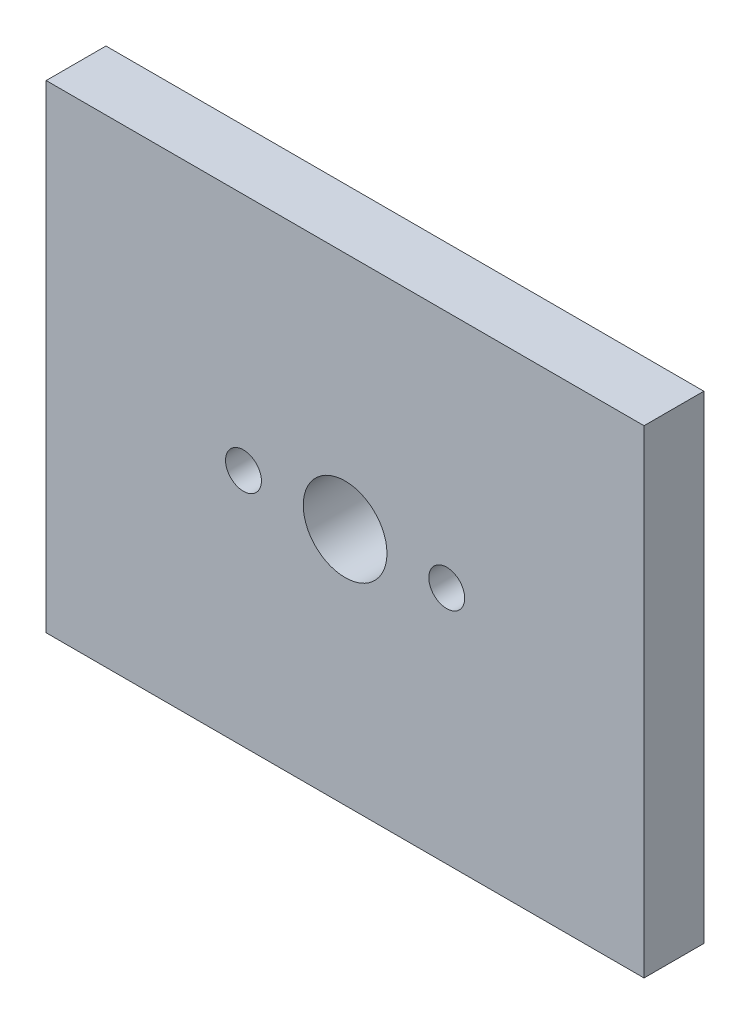
ISO-10303-21;
HEADER;
FILE_DESCRIPTION(('STEP AP214'),'2;1');
FILE_NAME('part.step','',(''),(''),'','','');
FILE_SCHEMA(('AUTOMOTIVE_DESIGN { 1 0 10303 214 1 1 1 1 }'));
ENDSEC;
DATA;
#1=APPLICATION_CONTEXT('core data for automotive mechanical design processes');
#2=APPLICATION_PROTOCOL_DEFINITION('international standard','automotive_design',2000,#1);
#3=PRODUCT_CONTEXT('',#1,'mechanical');
#4=PRODUCT('Part','Part','',(#3));
#5=PRODUCT_RELATED_PRODUCT_CATEGORY('part','',(#4));
#6=PRODUCT_DEFINITION_FORMATION('','',#4);
#7=PRODUCT_DEFINITION_CONTEXT('part definition',#1,'design');
#8=PRODUCT_DEFINITION('design','',#6,#7);
#9=PRODUCT_DEFINITION_SHAPE('','',#8);
#10=(LENGTH_UNIT() NAMED_UNIT(*) SI_UNIT(.MILLI.,.METRE.));
#11=(NAMED_UNIT(*) PLANE_ANGLE_UNIT() SI_UNIT($,.RADIAN.));
#12=(NAMED_UNIT(*) SI_UNIT($,.STERADIAN.) SOLID_ANGLE_UNIT());
#13=UNCERTAINTY_MEASURE_WITH_UNIT(LENGTH_MEASURE(1.E-05),#10,'distance_accuracy_value','');
#14=(GEOMETRIC_REPRESENTATION_CONTEXT(3) GLOBAL_UNCERTAINTY_ASSIGNED_CONTEXT((#13)) GLOBAL_UNIT_ASSIGNED_CONTEXT((#10,
#11,#12)) REPRESENTATION_CONTEXT('',''));
#15=CARTESIAN_POINT('',(0.,0.,0.));
#16=DIRECTION('',(0.,0.,1.));
#17=DIRECTION('',(1.,0.,0.));
#18=AXIS2_PLACEMENT_3D('',#15,#16,#17);
#19=CARTESIAN_POINT('',(-25.,-20.,5.));
#20=DIRECTION('',(1.,0.,0.));
#21=DIRECTION('',(0.,0.,-1.));
#22=AXIS2_PLACEMENT_3D('',#19,#20,#21);
#23=PLANE('',#22);
#24=DIRECTION('',(0.,-1.,0.));
#25=VECTOR('',#24,1.);
#26=CARTESIAN_POINT('',(-25.,-20.,0.));
#27=LINE('',#26,#25);
#28=CARTESIAN_POINT('',(-25.,20.,0.));
#29=VERTEX_POINT('',#28);
#30=CARTESIAN_POINT('',(-25.,-20.,0.));
#31=VERTEX_POINT('',#30);
#32=EDGE_CURVE('E106',#29,#31,#27,.T.);
#33=ORIENTED_EDGE('',*,*,#32,.T.);
#34=DIRECTION('',(0.,0.,-1.));
#35=VECTOR('',#34,1.);
#36=CARTESIAN_POINT('',(-25.,-20.,5.));
#37=LINE('',#36,#35);
#38=CARTESIAN_POINT('',(-25.,-20.,5.));
#39=VERTEX_POINT('',#38);
#40=EDGE_CURVE('E11',#39,#31,#37,.T.);
#41=ORIENTED_EDGE('',*,*,#40,.F.);
#42=DIRECTION('',(0.,-1.,0.));
#43=VECTOR('',#42,1.);
#44=CARTESIAN_POINT('',(-25.,-20.,5.));
#45=LINE('',#44,#43);
#46=CARTESIAN_POINT('',(-25.,20.,5.));
#47=VERTEX_POINT('',#46);
#48=EDGE_CURVE('E90',#47,#39,#45,.T.);
#49=ORIENTED_EDGE('',*,*,#48,.F.);
#50=DIRECTION('',(0.,0.,-1.));
#51=VECTOR('',#50,1.);
#52=CARTESIAN_POINT('',(-25.,20.,5.));
#53=LINE('',#52,#51);
#54=EDGE_CURVE('E102',#47,#29,#53,.T.);
#55=ORIENTED_EDGE('',*,*,#54,.T.);
#56=EDGE_LOOP('',(#33,#41,#49,#55));
#57=FACE_BOUND('',#56,.T.);
#58=ADVANCED_FACE('F38',(#57),#23,.F.);
#59=CARTESIAN_POINT('',(25.,-20.,5.));
#60=DIRECTION('',(0.,1.,0.));
#61=DIRECTION('',(-1.,0.,0.));
#62=AXIS2_PLACEMENT_3D('',#59,#60,#61);
#63=PLANE('',#62);
#64=DIRECTION('',(1.,0.,0.));
#65=VECTOR('',#64,1.);
#66=CARTESIAN_POINT('',(25.,-20.,0.));
#67=LINE('',#66,#65);
#68=CARTESIAN_POINT('',(25.,-20.,0.));
#69=VERTEX_POINT('',#68);
#70=EDGE_CURVE('E95',#31,#69,#67,.T.);
#71=ORIENTED_EDGE('',*,*,#70,.T.);
#72=DIRECTION('',(0.,0.,-1.));
#73=VECTOR('',#72,1.);
#74=CARTESIAN_POINT('',(25.,-20.,5.));
#75=LINE('',#74,#73);
#76=CARTESIAN_POINT('',(25.,-20.,5.));
#77=VERTEX_POINT('',#76);
#78=EDGE_CURVE('E47',#77,#69,#75,.T.);
#79=ORIENTED_EDGE('',*,*,#78,.F.);
#80=DIRECTION('',(1.,0.,0.));
#81=VECTOR('',#80,1.);
#82=CARTESIAN_POINT('',(25.,-20.,5.));
#83=LINE('',#82,#81);
#84=EDGE_CURVE('E85',#39,#77,#83,.T.);
#85=ORIENTED_EDGE('',*,*,#84,.F.);
#86=ORIENTED_EDGE('',*,*,#40,.T.);
#87=EDGE_LOOP('',(#71,#79,#85,#86));
#88=FACE_BOUND('',#87,.T.);
#89=ADVANCED_FACE('F94',(#88),#63,.F.);
#90=CARTESIAN_POINT('',(25.,-20.,5.));
#91=DIRECTION('',(-1.,0.,0.));
#92=DIRECTION('',(0.,0.,1.));
#93=AXIS2_PLACEMENT_3D('',#90,#91,#92);
#94=PLANE('',#93);
#95=DIRECTION('',(0.,1.,0.));
#96=VECTOR('',#95,1.);
#97=CARTESIAN_POINT('',(25.,-20.,0.));
#98=LINE('',#97,#96);
#99=CARTESIAN_POINT('',(25.,20.,0.));
#100=VERTEX_POINT('',#99);
#101=EDGE_CURVE('E72',#69,#100,#98,.T.);
#102=ORIENTED_EDGE('',*,*,#101,.T.);
#103=DIRECTION('',(0.,0.,-1.));
#104=VECTOR('',#103,1.);
#105=CARTESIAN_POINT('',(25.,20.,5.));
#106=LINE('',#105,#104);
#107=CARTESIAN_POINT('',(25.,20.,5.));
#108=VERTEX_POINT('',#107);
#109=EDGE_CURVE('E97',#108,#100,#106,.T.);
#110=ORIENTED_EDGE('',*,*,#109,.F.);
#111=DIRECTION('',(0.,1.,0.));
#112=VECTOR('',#111,1.);
#113=CARTESIAN_POINT('',(25.,-20.,5.));
#114=LINE('',#113,#112);
#115=EDGE_CURVE('E88',#77,#108,#114,.T.);
#116=ORIENTED_EDGE('',*,*,#115,.F.);
#117=ORIENTED_EDGE('',*,*,#78,.T.);
#118=EDGE_LOOP('',(#102,#110,#116,#117));
#119=FACE_BOUND('',#118,.T.);
#120=ADVANCED_FACE('F98',(#119),#94,.F.);
#121=CARTESIAN_POINT('',(25.,20.,5.));
#122=DIRECTION('',(0.,-1.,0.));
#123=DIRECTION('',(1.,0.,0.));
#124=AXIS2_PLACEMENT_3D('',#121,#122,#123);
#125=PLANE('',#124);
#126=DIRECTION('',(-1.,0.,0.));
#127=VECTOR('',#126,1.);
#128=CARTESIAN_POINT('',(25.,20.,0.));
#129=LINE('',#128,#127);
#130=EDGE_CURVE('E78',#100,#29,#129,.T.);
#131=ORIENTED_EDGE('',*,*,#130,.T.);
#132=ORIENTED_EDGE('',*,*,#54,.F.);
#133=DIRECTION('',(-1.,0.,0.));
#134=VECTOR('',#133,1.);
#135=CARTESIAN_POINT('',(25.,20.,5.));
#136=LINE('',#135,#134);
#137=EDGE_CURVE('E55',#108,#47,#136,.T.);
#138=ORIENTED_EDGE('',*,*,#137,.F.);
#139=ORIENTED_EDGE('',*,*,#109,.T.);
#140=EDGE_LOOP('',(#131,#132,#138,#139));
#141=FACE_BOUND('',#140,.T.);
#142=ADVANCED_FACE('F120',(#141),#125,.F.);
#143=CARTESIAN_POINT('',(0.,0.,5.));
#144=DIRECTION('',(0.,0.,1.));
#145=DIRECTION('',(1.,0.,0.));
#146=AXIS2_PLACEMENT_3D('',#143,#144,#145);
#147=PLANE('',#146);
#148=CARTESIAN_POINT('',(8.5,0.,5.));
#149=DIRECTION('',(0.,0.,1.));
#150=DIRECTION('',(1.,0.,0.));
#151=AXIS2_PLACEMENT_3D('',#148,#149,#150);
#152=CIRCLE('',#151,1.5);
#153=CARTESIAN_POINT('',(10.,0.,5.));
#154=VERTEX_POINT('',#153);
#155=EDGE_CURVE('E110',#154,#154,#152,.T.);
#156=ORIENTED_EDGE('',*,*,#155,.F.);
#157=EDGE_LOOP('',(#156));
#158=FACE_BOUND('',#157,.T.);
#159=CARTESIAN_POINT('',(0.,0.,5.));
#160=DIRECTION('',(0.,0.,1.));
#161=DIRECTION('',(1.,0.,0.));
#162=AXIS2_PLACEMENT_3D('',#159,#160,#161);
#163=CIRCLE('',#162,3.5);
#164=CARTESIAN_POINT('',(3.5,0.,5.));
#165=VERTEX_POINT('',#164);
#166=EDGE_CURVE('E130',#165,#165,#163,.T.);
#167=ORIENTED_EDGE('',*,*,#166,.F.);
#168=EDGE_LOOP('',(#167));
#169=FACE_BOUND('',#168,.T.);
#170=CARTESIAN_POINT('',(-8.5,0.,5.));
#171=DIRECTION('',(0.,0.,1.));
#172=DIRECTION('',(1.,0.,0.));
#173=AXIS2_PLACEMENT_3D('',#170,#171,#172);
#174=CIRCLE('',#173,1.5);
#175=CARTESIAN_POINT('',(-7.,0.,5.));
#176=VERTEX_POINT('',#175);
#177=EDGE_CURVE('E134',#176,#176,#174,.T.);
#178=ORIENTED_EDGE('',*,*,#177,.F.);
#179=EDGE_LOOP('',(#178));
#180=FACE_BOUND('',#179,.T.);
#181=ORIENTED_EDGE('',*,*,#48,.T.);
#182=ORIENTED_EDGE('',*,*,#84,.T.);
#183=ORIENTED_EDGE('',*,*,#115,.T.);
#184=ORIENTED_EDGE('',*,*,#137,.T.);
#185=EDGE_LOOP('',(#181,#182,#183,#184));
#186=FACE_BOUND('',#185,.T.);
#187=ADVANCED_FACE('F86',(#158,#169,#180,#186),#147,.T.);
#188=CARTESIAN_POINT('',(0.,0.,0.));
#189=DIRECTION('',(0.,0.,1.));
#190=DIRECTION('',(1.,0.,0.));
#191=AXIS2_PLACEMENT_3D('',#188,#189,#190);
#192=PLANE('',#191);
#193=CARTESIAN_POINT('',(8.5,0.,0.));
#194=DIRECTION('',(0.,0.,-1.));
#195=DIRECTION('',(-1.,0.,0.));
#196=AXIS2_PLACEMENT_3D('',#193,#194,#195);
#197=CIRCLE('',#196,1.5);
#198=CARTESIAN_POINT('',(7.,0.,0.));
#199=VERTEX_POINT('',#198);
#200=EDGE_CURVE('E138',#199,#199,#197,.T.);
#201=ORIENTED_EDGE('',*,*,#200,.F.);
#202=EDGE_LOOP('',(#201));
#203=FACE_BOUND('',#202,.T.);
#204=CARTESIAN_POINT('',(0.,0.,0.));
#205=DIRECTION('',(0.,0.,-1.));
#206=DIRECTION('',(-1.,0.,0.));
#207=AXIS2_PLACEMENT_3D('',#204,#205,#206);
#208=CIRCLE('',#207,3.5);
#209=CARTESIAN_POINT('',(-3.5,0.,0.));
#210=VERTEX_POINT('',#209);
#211=EDGE_CURVE('E143',#210,#210,#208,.T.);
#212=ORIENTED_EDGE('',*,*,#211,.F.);
#213=EDGE_LOOP('',(#212));
#214=FACE_BOUND('',#213,.T.);
#215=CARTESIAN_POINT('',(-8.5,0.,0.));
#216=DIRECTION('',(0.,0.,-1.));
#217=DIRECTION('',(-1.,0.,0.));
#218=AXIS2_PLACEMENT_3D('',#215,#216,#217);
#219=CIRCLE('',#218,1.5);
#220=CARTESIAN_POINT('',(-10.,0.,0.));
#221=VERTEX_POINT('',#220);
#222=EDGE_CURVE('E139',#221,#221,#219,.T.);
#223=ORIENTED_EDGE('',*,*,#222,.F.);
#224=EDGE_LOOP('',(#223));
#225=FACE_BOUND('',#224,.T.);
#226=ORIENTED_EDGE('',*,*,#32,.F.);
#227=ORIENTED_EDGE('',*,*,#130,.F.);
#228=ORIENTED_EDGE('',*,*,#101,.F.);
#229=ORIENTED_EDGE('',*,*,#70,.F.);
#230=EDGE_LOOP('',(#226,#227,#228,#229));
#231=FACE_BOUND('',#230,.T.);
#232=ADVANCED_FACE('F123',(#203,#214,#225,#231),#192,.F.);
#233=CARTESIAN_POINT('',(-8.5,0.,10.));
#234=DIRECTION('',(0.,0.,-1.));
#235=DIRECTION('',(-1.,0.,0.));
#236=AXIS2_PLACEMENT_3D('',#233,#234,#235);
#237=CYLINDRICAL_SURFACE('',#236,1.5);
#238=ORIENTED_EDGE('',*,*,#177,.T.);
#239=EDGE_LOOP('',(#238));
#240=FACE_BOUND('',#239,.T.);
#241=ORIENTED_EDGE('',*,*,#222,.T.);
#242=EDGE_LOOP('',(#241));
#243=FACE_BOUND('',#242,.T.);
#244=ADVANCED_FACE('F155',(#240,#243),#237,.F.);
#245=CARTESIAN_POINT('',(0.,0.,10.));
#246=DIRECTION('',(0.,0.,-1.));
#247=DIRECTION('',(-1.,0.,0.));
#248=AXIS2_PLACEMENT_3D('',#245,#246,#247);
#249=CYLINDRICAL_SURFACE('',#248,3.5);
#250=ORIENTED_EDGE('',*,*,#166,.T.);
#251=EDGE_LOOP('',(#250));
#252=FACE_BOUND('',#251,.T.);
#253=ORIENTED_EDGE('',*,*,#211,.T.);
#254=EDGE_LOOP('',(#253));
#255=FACE_BOUND('',#254,.T.);
#256=ADVANCED_FACE('F162',(#252,#255),#249,.F.);
#257=CARTESIAN_POINT('',(8.5,0.,10.));
#258=DIRECTION('',(0.,0.,-1.));
#259=DIRECTION('',(-1.,0.,0.));
#260=AXIS2_PLACEMENT_3D('',#257,#258,#259);
#261=CYLINDRICAL_SURFACE('',#260,1.5);
#262=ORIENTED_EDGE('',*,*,#155,.T.);
#263=EDGE_LOOP('',(#262));
#264=FACE_BOUND('',#263,.T.);
#265=ORIENTED_EDGE('',*,*,#200,.T.);
#266=EDGE_LOOP('',(#265));
#267=FACE_BOUND('',#266,.T.);
#268=ADVANCED_FACE('F151',(#264,#267),#261,.F.);
#269=CLOSED_SHELL('',(#58,#89,#120,#142,#187,#232,#244,#256,#268));
#270=MANIFOLD_SOLID_BREP('B2',#269);
#271=ADVANCED_BREP_SHAPE_REPRESENTATION('',(#18,#270),#14);
#272=SHAPE_DEFINITION_REPRESENTATION(#9,#271);
ENDSEC;
END-ISO-10303-21;
